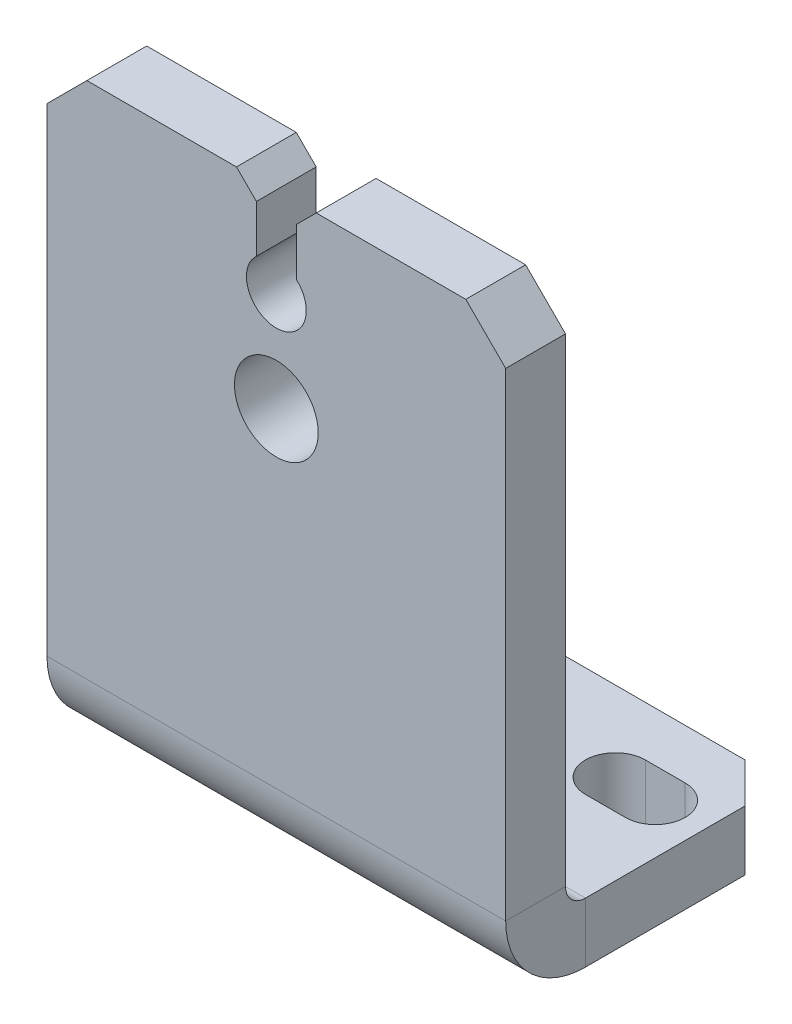
ISO-10303-21;
HEADER;
FILE_DESCRIPTION(('STEP AP214'),'2;1');
FILE_NAME('part.step','',(''),(''),'','','');
FILE_SCHEMA(('AUTOMOTIVE_DESIGN { 1 0 10303 214 1 1 1 1 }'));
ENDSEC;
DATA;
#1=APPLICATION_CONTEXT('core data for automotive mechanical design processes');
#2=APPLICATION_PROTOCOL_DEFINITION('international standard','automotive_design',2000,#1);
#3=PRODUCT_CONTEXT('',#1,'mechanical');
#4=PRODUCT('Part','Part','',(#3));
#5=PRODUCT_RELATED_PRODUCT_CATEGORY('part','',(#4));
#6=PRODUCT_DEFINITION_FORMATION('','',#4);
#7=PRODUCT_DEFINITION_CONTEXT('part definition',#1,'design');
#8=PRODUCT_DEFINITION('design','',#6,#7);
#9=PRODUCT_DEFINITION_SHAPE('','',#8);
#10=(LENGTH_UNIT() NAMED_UNIT(*) SI_UNIT(.MILLI.,.METRE.));
#11=(NAMED_UNIT(*) PLANE_ANGLE_UNIT() SI_UNIT($,.RADIAN.));
#12=(NAMED_UNIT(*) SI_UNIT($,.STERADIAN.) SOLID_ANGLE_UNIT());
#13=UNCERTAINTY_MEASURE_WITH_UNIT(LENGTH_MEASURE(1.E-05),#10,'distance_accuracy_value','');
#14=(GEOMETRIC_REPRESENTATION_CONTEXT(3) GLOBAL_UNCERTAINTY_ASSIGNED_CONTEXT((#13)) GLOBAL_UNIT_ASSIGNED_CONTEXT((#10,
#11,#12)) REPRESENTATION_CONTEXT('',''));
#15=CARTESIAN_POINT('',(0.,0.,0.));
#16=DIRECTION('',(0.,0.,1.));
#17=DIRECTION('',(1.,0.,0.));
#18=AXIS2_PLACEMENT_3D('',#15,#16,#17);
#19=CARTESIAN_POINT('',(-11.5,30.,-3.));
#20=DIRECTION('',(0.,1.,0.));
#21=DIRECTION('',(-1.,0.,0.));
#22=AXIS2_PLACEMENT_3D('',#19,#20,#21);
#23=PLANE('',#22);
#24=DIRECTION('',(-1.,0.,0.));
#25=VECTOR('',#24,1.);
#26=CARTESIAN_POINT('',(-11.5,30.,-3.));
#27=LINE('',#26,#25);
#28=CARTESIAN_POINT('',(9.5,30.,-3.));
#29=VERTEX_POINT('',#28);
#30=CARTESIAN_POINT('',(2.,30.,-3.));
#31=VERTEX_POINT('',#30);
#32=EDGE_CURVE('E302',#29,#31,#27,.T.);
#33=ORIENTED_EDGE('',*,*,#32,.T.);
#34=DIRECTION('',(0.,0.,1.));
#35=VECTOR('',#34,1.);
#36=CARTESIAN_POINT('',(2.,30.,0.));
#37=LINE('',#36,#35);
#38=CARTESIAN_POINT('',(2.,30.,0.));
#39=VERTEX_POINT('',#38);
#40=EDGE_CURVE('E25',#31,#39,#37,.T.);
#41=ORIENTED_EDGE('',*,*,#40,.T.);
#42=DIRECTION('',(-1.,0.,0.));
#43=VECTOR('',#42,1.);
#44=CARTESIAN_POINT('',(-11.5,30.,0.));
#45=LINE('',#44,#43);
#46=CARTESIAN_POINT('',(9.5,30.,0.));
#47=VERTEX_POINT('',#46);
#48=EDGE_CURVE('E298',#47,#39,#45,.T.);
#49=ORIENTED_EDGE('',*,*,#48,.F.);
#50=DIRECTION('',(0.,0.,-1.));
#51=VECTOR('',#50,1.);
#52=CARTESIAN_POINT('',(9.5,30.,-3.));
#53=LINE('',#52,#51);
#54=EDGE_CURVE('E330',#47,#29,#53,.T.);
#55=ORIENTED_EDGE('',*,*,#54,.T.);
#56=EDGE_LOOP('',(#33,#41,#49,#55));
#57=FACE_BOUND('',#56,.T.);
#58=ADVANCED_FACE('F17',(#57),#23,.T.);
#59=CARTESIAN_POINT('',(-11.5,30.,-3.));
#60=DIRECTION('',(-1.,0.,0.));
#61=DIRECTION('',(0.,-1.,0.));
#62=AXIS2_PLACEMENT_3D('',#59,#60,#61);
#63=PLANE('',#62);
#64=DIRECTION('',(0.,-1.,0.));
#65=VECTOR('',#64,1.);
#66=CARTESIAN_POINT('',(-11.5,30.,0.));
#67=LINE('',#66,#65);
#68=CARTESIAN_POINT('',(-11.5,28.,0.));
#69=VERTEX_POINT('',#68);
#70=CARTESIAN_POINT('',(-11.5,4.,0.));
#71=VERTEX_POINT('',#70);
#72=EDGE_CURVE('E292',#69,#71,#67,.T.);
#73=ORIENTED_EDGE('',*,*,#72,.F.);
#74=DIRECTION('',(0.,0.,-1.));
#75=VECTOR('',#74,1.);
#76=CARTESIAN_POINT('',(-11.5,28.,-3.));
#77=LINE('',#76,#75);
#78=CARTESIAN_POINT('',(-11.5,28.,-3.));
#79=VERTEX_POINT('',#78);
#80=EDGE_CURVE('E320',#69,#79,#77,.T.);
#81=ORIENTED_EDGE('',*,*,#80,.T.);
#82=DIRECTION('',(0.,-1.,0.));
#83=VECTOR('',#82,1.);
#84=CARTESIAN_POINT('',(-11.5,30.,-3.));
#85=LINE('',#84,#83);
#86=CARTESIAN_POINT('',(-11.5,4.,-3.));
#87=VERTEX_POINT('',#86);
#88=EDGE_CURVE('E295',#79,#87,#85,.T.);
#89=ORIENTED_EDGE('',*,*,#88,.T.);
#90=DIRECTION('',(0.,0.,1.));
#91=VECTOR('',#90,1.);
#92=CARTESIAN_POINT('',(-11.5,4.,-3.));
#93=LINE('',#92,#91);
#94=EDGE_CURVE('E279',#87,#71,#93,.T.);
#95=ORIENTED_EDGE('',*,*,#94,.T.);
#96=EDGE_LOOP('',(#73,#81,#89,#95));
#97=FACE_BOUND('',#96,.T.);
#98=ADVANCED_FACE('F436',(#97),#63,.T.);
#99=CARTESIAN_POINT('',(-11.5,0.,-3.));
#100=DIRECTION('',(0.,0.,1.));
#101=DIRECTION('',(1.,0.,0.));
#102=AXIS2_PLACEMENT_3D('',#99,#100,#101);
#103=PLANE('',#102);
#104=CARTESIAN_POINT('',(0.,20.5,-3.));
#105=DIRECTION('',(0.,0.,1.));
#106=DIRECTION('',(1.,0.,0.));
#107=AXIS2_PLACEMENT_3D('',#104,#105,#106);
#108=CIRCLE('',#107,2.1);
#109=CARTESIAN_POINT('',(2.1,20.5,-3.));
#110=VERTEX_POINT('',#109);
#111=EDGE_CURVE('E241',#110,#110,#108,.F.);
#112=ORIENTED_EDGE('',*,*,#111,.F.);
#113=EDGE_LOOP('',(#112));
#114=FACE_BOUND('',#113,.T.);
#115=CARTESIAN_POINT('',(-2.,30.,-3.));
#116=VERTEX_POINT('',#115);
#117=CARTESIAN_POINT('',(-9.5,30.,-3.));
#118=VERTEX_POINT('',#117);
#119=EDGE_CURVE('E301',#116,#118,#27,.T.);
#120=ORIENTED_EDGE('',*,*,#119,.F.);
#121=DIRECTION('',(0.707106781186549,-0.707106781186546,0.));
#122=VECTOR('',#121,1.);
#123=CARTESIAN_POINT('',(-1.,29.,-3.));
#124=LINE('',#123,#122);
#125=CARTESIAN_POINT('',(-1.,29.,-3.));
#126=VERTEX_POINT('',#125);
#127=EDGE_CURVE('E360',#116,#126,#124,.T.);
#128=ORIENTED_EDGE('',*,*,#127,.T.);
#129=DIRECTION('',(0.,1.,0.));
#130=VECTOR('',#129,1.);
#131=CARTESIAN_POINT('',(-1.,30.,-3.));
#132=LINE('',#131,#130);
#133=CARTESIAN_POINT('',(-1.,26.6180339887499,-3.));
#134=VERTEX_POINT('',#133);
#135=EDGE_CURVE('E233',#134,#126,#132,.T.);
#136=ORIENTED_EDGE('',*,*,#135,.F.);
#137=CARTESIAN_POINT('',(0.,25.5,-3.));
#138=DIRECTION('',(0.,0.,1.));
#139=DIRECTION('',(1.,0.,0.));
#140=AXIS2_PLACEMENT_3D('',#137,#138,#139);
#141=CIRCLE('',#140,1.5);
#142=CARTESIAN_POINT('',(1.,26.6180339887499,-3.));
#143=VERTEX_POINT('',#142);
#144=EDGE_CURVE('E218',#143,#134,#141,.F.);
#145=ORIENTED_EDGE('',*,*,#144,.F.);
#146=DIRECTION('',(0.,-1.,0.));
#147=VECTOR('',#146,1.);
#148=CARTESIAN_POINT('',(1.,26.6180339887499,-3.));
#149=LINE('',#148,#147);
#150=CARTESIAN_POINT('',(1.,29.,-3.));
#151=VERTEX_POINT('',#150);
#152=EDGE_CURVE('E221',#151,#143,#149,.T.);
#153=ORIENTED_EDGE('',*,*,#152,.F.);
#154=DIRECTION('',(0.707106781186546,0.707106781186549,0.));
#155=VECTOR('',#154,1.);
#156=CARTESIAN_POINT('',(2.,30.,-3.));
#157=LINE('',#156,#155);
#158=EDGE_CURVE('E32',#151,#31,#157,.T.);
#159=ORIENTED_EDGE('',*,*,#158,.T.);
#160=ORIENTED_EDGE('',*,*,#32,.F.);
#161=DIRECTION('',(-0.707106781186548,0.707106781186547,0.));
#162=VECTOR('',#161,1.);
#163=CARTESIAN_POINT('',(11.5,28.,-3.));
#164=LINE('',#163,#162);
#165=CARTESIAN_POINT('',(11.5,28.,-3.));
#166=VERTEX_POINT('',#165);
#167=EDGE_CURVE('E322',#29,#166,#164,.F.);
#168=ORIENTED_EDGE('',*,*,#167,.T.);
#169=DIRECTION('',(0.,1.,0.));
#170=VECTOR('',#169,1.);
#171=CARTESIAN_POINT('',(11.5,30.,-3.));
#172=LINE('',#171,#170);
#173=CARTESIAN_POINT('',(11.5,4.,-3.));
#174=VERTEX_POINT('',#173);
#175=EDGE_CURVE('E297',#174,#166,#172,.T.);
#176=ORIENTED_EDGE('',*,*,#175,.F.);
#177=DIRECTION('',(-1.,0.,0.));
#178=VECTOR('',#177,1.);
#179=CARTESIAN_POINT('',(-11.5,4.,-3.));
#180=LINE('',#179,#178);
#181=EDGE_CURVE('E285',#87,#174,#180,.F.);
#182=ORIENTED_EDGE('',*,*,#181,.F.);
#183=ORIENTED_EDGE('',*,*,#88,.F.);
#184=DIRECTION('',(-0.707106781186547,-0.707106781186548,0.));
#185=VECTOR('',#184,1.);
#186=CARTESIAN_POINT('',(-9.5,30.,-3.));
#187=LINE('',#186,#185);
#188=EDGE_CURVE('E324',#79,#118,#187,.F.);
#189=ORIENTED_EDGE('',*,*,#188,.T.);
#190=EDGE_LOOP('',(#120,#128,#136,#145,#153,#159,#160,#168,#176,#182,#183,#189));
#191=FACE_BOUND('',#190,.T.);
#192=ADVANCED_FACE('F383',(#114,#191),#103,.F.);
#193=CARTESIAN_POINT('',(-11.5,0.,0.));
#194=DIRECTION('',(0.,0.,1.));
#195=DIRECTION('',(1.,0.,0.));
#196=AXIS2_PLACEMENT_3D('',#193,#194,#195);
#197=PLANE('',#196);
#198=DIRECTION('',(0.,-1.,0.));
#199=VECTOR('',#198,1.);
#200=CARTESIAN_POINT('',(-1.,30.,0.));
#201=LINE('',#200,#199);
#202=CARTESIAN_POINT('',(-1.,29.,0.));
#203=VERTEX_POINT('',#202);
#204=CARTESIAN_POINT('',(-1.,26.6180339887499,0.));
#205=VERTEX_POINT('',#204);
#206=EDGE_CURVE('E223',#203,#205,#201,.T.);
#207=ORIENTED_EDGE('',*,*,#206,.F.);
#208=DIRECTION('',(-0.707106781186549,0.707106781186546,0.));
#209=VECTOR('',#208,1.);
#210=CARTESIAN_POINT('',(8.25,19.75,0.));
#211=LINE('',#210,#209);
#212=CARTESIAN_POINT('',(-2.,30.,0.));
#213=VERTEX_POINT('',#212);
#214=EDGE_CURVE('E355',#203,#213,#211,.T.);
#215=ORIENTED_EDGE('',*,*,#214,.T.);
#216=CARTESIAN_POINT('',(-9.5,30.,0.));
#217=VERTEX_POINT('',#216);
#218=EDGE_CURVE('E309',#213,#217,#45,.T.);
#219=ORIENTED_EDGE('',*,*,#218,.T.);
#220=DIRECTION('',(0.707106781186547,0.707106781186548,0.));
#221=VECTOR('',#220,1.);
#222=CARTESIAN_POINT('',(-25.5,14.,0.));
#223=LINE('',#222,#221);
#224=EDGE_CURVE('E318',#217,#69,#223,.F.);
#225=ORIENTED_EDGE('',*,*,#224,.T.);
#226=ORIENTED_EDGE('',*,*,#72,.T.);
#227=DIRECTION('',(-1.,0.,0.));
#228=VECTOR('',#227,1.);
#229=CARTESIAN_POINT('',(-11.5,4.,0.));
#230=LINE('',#229,#228);
#231=CARTESIAN_POINT('',(11.5,4.,0.));
#232=VERTEX_POINT('',#231);
#233=EDGE_CURVE('E272',#71,#232,#230,.F.);
#234=ORIENTED_EDGE('',*,*,#233,.T.);
#235=DIRECTION('',(0.,1.,0.));
#236=VECTOR('',#235,1.);
#237=CARTESIAN_POINT('',(11.5,30.,0.));
#238=LINE('',#237,#236);
#239=CARTESIAN_POINT('',(11.5,28.,0.));
#240=VERTEX_POINT('',#239);
#241=EDGE_CURVE('E306',#232,#240,#238,.T.);
#242=ORIENTED_EDGE('',*,*,#241,.T.);
#243=DIRECTION('',(0.707106781186548,-0.707106781186547,0.));
#244=VECTOR('',#243,1.);
#245=CARTESIAN_POINT('',(14.,25.5,0.));
#246=LINE('',#245,#244);
#247=EDGE_CURVE('E316',#240,#47,#246,.F.);
#248=ORIENTED_EDGE('',*,*,#247,.T.);
#249=ORIENTED_EDGE('',*,*,#48,.T.);
#250=DIRECTION('',(-0.707106781186546,-0.707106781186549,0.));
#251=VECTOR('',#250,1.);
#252=CARTESIAN_POINT('',(-19.75,8.25,0.));
#253=LINE('',#252,#251);
#254=CARTESIAN_POINT('',(1.,29.,0.));
#255=VERTEX_POINT('',#254);
#256=EDGE_CURVE('E353',#39,#255,#253,.T.);
#257=ORIENTED_EDGE('',*,*,#256,.T.);
#258=DIRECTION('',(0.,1.,0.));
#259=VECTOR('',#258,1.);
#260=CARTESIAN_POINT('',(1.,26.6180339887499,0.));
#261=LINE('',#260,#259);
#262=CARTESIAN_POINT('',(1.,26.6180339887499,0.));
#263=VERTEX_POINT('',#262);
#264=EDGE_CURVE('E228',#263,#255,#261,.T.);
#265=ORIENTED_EDGE('',*,*,#264,.F.);
#266=CARTESIAN_POINT('',(0.,25.5,0.));
#267=DIRECTION('',(0.,0.,1.));
#268=DIRECTION('',(1.,0.,0.));
#269=AXIS2_PLACEMENT_3D('',#266,#267,#268);
#270=CIRCLE('',#269,1.5);
#271=EDGE_CURVE('E225',#205,#263,#270,.T.);
#272=ORIENTED_EDGE('',*,*,#271,.F.);
#273=EDGE_LOOP('',(#207,#215,#219,#225,#226,#234,#242,#248,#249,#257,#265,#272));
#274=FACE_BOUND('',#273,.T.);
#275=CARTESIAN_POINT('',(0.,20.5,0.));
#276=DIRECTION('',(0.,0.,1.));
#277=DIRECTION('',(1.,0.,0.));
#278=AXIS2_PLACEMENT_3D('',#275,#276,#277);
#279=CIRCLE('',#278,2.1);
#280=CARTESIAN_POINT('',(2.1,20.5,0.));
#281=VERTEX_POINT('',#280);
#282=EDGE_CURVE('E238',#281,#281,#279,.T.);
#283=ORIENTED_EDGE('',*,*,#282,.F.);
#284=EDGE_LOOP('',(#283));
#285=FACE_BOUND('',#284,.T.);
#286=ADVANCED_FACE('F369',(#274,#285),#197,.T.);
#287=ORIENTED_EDGE('',*,*,#218,.F.);
#288=DIRECTION('',(0.,0.,-1.));
#289=VECTOR('',#288,1.);
#290=CARTESIAN_POINT('',(-2.,30.,-3.));
#291=LINE('',#290,#289);
#292=EDGE_CURVE('E357',#213,#116,#291,.T.);
#293=ORIENTED_EDGE('',*,*,#292,.T.);
#294=ORIENTED_EDGE('',*,*,#119,.T.);
#295=DIRECTION('',(0.,0.,1.));
#296=VECTOR('',#295,1.);
#297=CARTESIAN_POINT('',(-9.5,30.,-3.));
#298=LINE('',#297,#296);
#299=EDGE_CURVE('E304',#118,#217,#298,.T.);
#300=ORIENTED_EDGE('',*,*,#299,.T.);
#301=EDGE_LOOP('',(#287,#293,#294,#300));
#302=FACE_BOUND('',#301,.T.);
#303=ADVANCED_FACE('F438',(#302),#23,.T.);
#304=CARTESIAN_POINT('',(11.5,30.,-3.));
#305=DIRECTION('',(1.,0.,0.));
#306=DIRECTION('',(0.,1.,0.));
#307=AXIS2_PLACEMENT_3D('',#304,#305,#306);
#308=PLANE('',#307);
#309=ORIENTED_EDGE('',*,*,#175,.T.);
#310=DIRECTION('',(0.,0.,1.));
#311=VECTOR('',#310,1.);
#312=CARTESIAN_POINT('',(11.5,28.,-3.));
#313=LINE('',#312,#311);
#314=EDGE_CURVE('E327',#166,#240,#313,.T.);
#315=ORIENTED_EDGE('',*,*,#314,.T.);
#316=ORIENTED_EDGE('',*,*,#241,.F.);
#317=DIRECTION('',(0.,0.,1.));
#318=VECTOR('',#317,1.);
#319=CARTESIAN_POINT('',(11.5,4.,-3.));
#320=LINE('',#319,#318);
#321=EDGE_CURVE('E289',#174,#232,#320,.T.);
#322=ORIENTED_EDGE('',*,*,#321,.F.);
#323=EDGE_LOOP('',(#309,#315,#316,#322));
#324=FACE_BOUND('',#323,.T.);
#325=ADVANCED_FACE('F378',(#324),#308,.T.);
#326=CARTESIAN_POINT('',(11.5,4.,-4.));
#327=DIRECTION('',(1.,0.,0.));
#328=DIRECTION('',(0.,0.,-1.));
#329=AXIS2_PLACEMENT_3D('',#326,#327,#328);
#330=PLANE('',#329);
#331=DIRECTION('',(0.,1.,0.));
#332=VECTOR('',#331,1.);
#333=CARTESIAN_POINT('',(11.5,0.,-4.));
#334=LINE('',#333,#332);
#335=CARTESIAN_POINT('',(11.5,3.,-4.));
#336=VERTEX_POINT('',#335);
#337=CARTESIAN_POINT('',(11.5,0.,-4.));
#338=VERTEX_POINT('',#337);
#339=EDGE_CURVE('E244',#336,#338,#334,.F.);
#340=ORIENTED_EDGE('',*,*,#339,.F.);
#341=CARTESIAN_POINT('',(11.5,4.,-4.));
#342=DIRECTION('',(-1.,0.,0.));
#343=DIRECTION('',(0.,0.,1.));
#344=AXIS2_PLACEMENT_3D('',#341,#342,#343);
#345=CIRCLE('',#344,1.);
#346=EDGE_CURVE('E282',#174,#336,#345,.F.);
#347=ORIENTED_EDGE('',*,*,#346,.F.);
#348=ORIENTED_EDGE('',*,*,#321,.T.);
#349=CARTESIAN_POINT('',(11.5,4.,-4.));
#350=DIRECTION('',(-1.,0.,0.));
#351=DIRECTION('',(0.,0.,1.));
#352=AXIS2_PLACEMENT_3D('',#349,#350,#351);
#353=CIRCLE('',#352,4.);
#354=EDGE_CURVE('E275',#232,#338,#353,.F.);
#355=ORIENTED_EDGE('',*,*,#354,.T.);
#356=EDGE_LOOP('',(#340,#347,#348,#355));
#357=FACE_BOUND('',#356,.T.);
#358=ADVANCED_FACE('F393',(#357),#330,.T.);
#359=CARTESIAN_POINT('',(-11.5,4.,-4.));
#360=DIRECTION('',(1.,0.,0.));
#361=DIRECTION('',(0.,0.,-1.));
#362=AXIS2_PLACEMENT_3D('',#359,#360,#361);
#363=PLANE('',#362);
#364=CARTESIAN_POINT('',(-11.5,4.,-4.));
#365=DIRECTION('',(-1.,0.,0.));
#366=DIRECTION('',(0.,0.,1.));
#367=AXIS2_PLACEMENT_3D('',#364,#365,#366);
#368=CIRCLE('',#367,1.);
#369=CARTESIAN_POINT('',(-11.5,3.,-4.));
#370=VERTEX_POINT('',#369);
#371=EDGE_CURVE('E247',#370,#87,#368,.T.);
#372=ORIENTED_EDGE('',*,*,#371,.F.);
#373=DIRECTION('',(0.,1.,0.));
#374=VECTOR('',#373,1.);
#375=CARTESIAN_POINT('',(-11.5,3.,-4.));
#376=LINE('',#375,#374);
#377=CARTESIAN_POINT('',(-11.5,0.,-4.));
#378=VERTEX_POINT('',#377);
#379=EDGE_CURVE('E265',#370,#378,#376,.F.);
#380=ORIENTED_EDGE('',*,*,#379,.T.);
#381=CARTESIAN_POINT('',(-11.5,4.,-4.));
#382=DIRECTION('',(-1.,0.,0.));
#383=DIRECTION('',(0.,0.,1.));
#384=AXIS2_PLACEMENT_3D('',#381,#382,#383);
#385=CIRCLE('',#384,4.);
#386=EDGE_CURVE('E276',#378,#71,#385,.T.);
#387=ORIENTED_EDGE('',*,*,#386,.T.);
#388=ORIENTED_EDGE('',*,*,#94,.F.);
#389=EDGE_LOOP('',(#372,#380,#387,#388));
#390=FACE_BOUND('',#389,.T.);
#391=ADVANCED_FACE('F405',(#390),#363,.F.);
#392=CARTESIAN_POINT('',(-11.5,4.,-4.));
#393=DIRECTION('',(-1.,0.,0.));
#394=DIRECTION('',(0.,-1.,0.));
#395=AXIS2_PLACEMENT_3D('',#392,#393,#394);
#396=CYLINDRICAL_SURFACE('',#395,4.);
#397=ORIENTED_EDGE('',*,*,#233,.F.);
#398=ORIENTED_EDGE('',*,*,#386,.F.);
#399=DIRECTION('',(-1.,0.,0.));
#400=VECTOR('',#399,1.);
#401=CARTESIAN_POINT('',(11.5,0.,-4.));
#402=LINE('',#401,#400);
#403=EDGE_CURVE('E262',#378,#338,#402,.F.);
#404=ORIENTED_EDGE('',*,*,#403,.T.);
#405=ORIENTED_EDGE('',*,*,#354,.F.);
#406=EDGE_LOOP('',(#397,#398,#404,#405));
#407=FACE_BOUND('',#406,.T.);
#408=ADVANCED_FACE('F651',(#407),#396,.T.);
#409=CARTESIAN_POINT('',(-11.5,4.,-4.));
#410=DIRECTION('',(-1.,0.,0.));
#411=DIRECTION('',(0.,-1.,0.));
#412=AXIS2_PLACEMENT_3D('',#409,#410,#411);
#413=CYLINDRICAL_SURFACE('',#412,1.);
#414=ORIENTED_EDGE('',*,*,#181,.T.);
#415=ORIENTED_EDGE('',*,*,#346,.T.);
#416=DIRECTION('',(-1.,0.,0.));
#417=VECTOR('',#416,1.);
#418=CARTESIAN_POINT('',(11.5,3.,-4.));
#419=LINE('',#418,#417);
#420=EDGE_CURVE('E268',#336,#370,#419,.T.);
#421=ORIENTED_EDGE('',*,*,#420,.T.);
#422=ORIENTED_EDGE('',*,*,#371,.T.);
#423=EDGE_LOOP('',(#414,#415,#421,#422));
#424=FACE_BOUND('',#423,.T.);
#425=ADVANCED_FACE('F388',(#424),#413,.F.);
#426=CARTESIAN_POINT('',(-11.5,0.,-14.));
#427=DIRECTION('',(1.,0.,0.));
#428=DIRECTION('',(0.,1.,0.));
#429=AXIS2_PLACEMENT_3D('',#426,#427,#428);
#430=PLANE('',#429);
#431=DIRECTION('',(0.,0.,1.));
#432=VECTOR('',#431,1.);
#433=CARTESIAN_POINT('',(-11.5,2.99999999999996,-14.));
#434=LINE('',#433,#432);
#435=CARTESIAN_POINT('',(-11.5,3.,-12.));
#436=VERTEX_POINT('',#435);
#437=EDGE_CURVE('E259',#370,#436,#434,.F.);
#438=ORIENTED_EDGE('',*,*,#437,.T.);
#439=DIRECTION('',(0.,-1.,0.));
#440=VECTOR('',#439,1.);
#441=CARTESIAN_POINT('',(-11.5,0.,-12.));
#442=LINE('',#441,#440);
#443=CARTESIAN_POINT('',(-11.5,0.,-12.));
#444=VERTEX_POINT('',#443);
#445=EDGE_CURVE('E341',#436,#444,#442,.T.);
#446=ORIENTED_EDGE('',*,*,#445,.T.);
#447=DIRECTION('',(0.,0.,-1.));
#448=VECTOR('',#447,1.);
#449=CARTESIAN_POINT('',(-11.5,0.,-3.));
#450=LINE('',#449,#448);
#451=EDGE_CURVE('E251',#378,#444,#450,.T.);
#452=ORIENTED_EDGE('',*,*,#451,.F.);
#453=ORIENTED_EDGE('',*,*,#379,.F.);
#454=EDGE_LOOP('',(#438,#446,#452,#453));
#455=FACE_BOUND('',#454,.T.);
#456=ADVANCED_FACE('F409',(#455),#430,.F.);
#457=CARTESIAN_POINT('',(11.5,0.,-3.));
#458=DIRECTION('',(-1.,0.,0.));
#459=DIRECTION('',(0.,-1.,0.));
#460=AXIS2_PLACEMENT_3D('',#457,#458,#459);
#461=PLANE('',#460);
#462=DIRECTION('',(0.,0.,1.));
#463=VECTOR('',#462,1.);
#464=CARTESIAN_POINT('',(11.5,0.,-3.));
#465=LINE('',#464,#463);
#466=CARTESIAN_POINT('',(11.5,0.,-12.));
#467=VERTEX_POINT('',#466);
#468=EDGE_CURVE('E245',#467,#338,#465,.T.);
#469=ORIENTED_EDGE('',*,*,#468,.F.);
#470=DIRECTION('',(0.,1.,0.));
#471=VECTOR('',#470,1.);
#472=CARTESIAN_POINT('',(11.5,0.,-12.));
#473=LINE('',#472,#471);
#474=CARTESIAN_POINT('',(11.5,3.,-12.));
#475=VERTEX_POINT('',#474);
#476=EDGE_CURVE('E347',#467,#475,#473,.T.);
#477=ORIENTED_EDGE('',*,*,#476,.T.);
#478=DIRECTION('',(0.,0.,-1.));
#479=VECTOR('',#478,1.);
#480=CARTESIAN_POINT('',(11.5,3.,-3.));
#481=LINE('',#480,#479);
#482=EDGE_CURVE('E254',#475,#336,#481,.F.);
#483=ORIENTED_EDGE('',*,*,#482,.T.);
#484=ORIENTED_EDGE('',*,*,#339,.T.);
#485=EDGE_LOOP('',(#469,#477,#483,#484));
#486=FACE_BOUND('',#485,.T.);
#487=ADVANCED_FACE('F396',(#486),#461,.F.);
#488=CARTESIAN_POINT('',(-11.5,0.,-3.));
#489=DIRECTION('',(0.,1.,0.));
#490=DIRECTION('',(0.,0.,1.));
#491=AXIS2_PLACEMENT_3D('',#488,#489,#490);
#492=PLANE('',#491);
#493=DIRECTION('',(1.,0.,0.));
#494=VECTOR('',#493,1.);
#495=CARTESIAN_POINT('',(7.,0.,-11.5));
#496=LINE('',#495,#494);
#497=CARTESIAN_POINT('',(7.,0.,-11.5));
#498=VERTEX_POINT('',#497);
#499=CARTESIAN_POINT('',(9.,0.,-11.5));
#500=VERTEX_POINT('',#499);
#501=EDGE_CURVE('E193',#498,#500,#496,.T.);
#502=ORIENTED_EDGE('',*,*,#501,.F.);
#503=CARTESIAN_POINT('',(7.,0.,-10.));
#504=DIRECTION('',(0.,-1.,0.));
#505=DIRECTION('',(0.,0.,-1.));
#506=AXIS2_PLACEMENT_3D('',#503,#504,#505);
#507=CIRCLE('',#506,1.5);
#508=CARTESIAN_POINT('',(7.,0.,-8.5));
#509=VERTEX_POINT('',#508);
#510=EDGE_CURVE('E185',#509,#498,#507,.T.);
#511=ORIENTED_EDGE('',*,*,#510,.F.);
#512=DIRECTION('',(-1.,0.,0.));
#513=VECTOR('',#512,1.);
#514=CARTESIAN_POINT('',(7.,0.,-8.5));
#515=LINE('',#514,#513);
#516=CARTESIAN_POINT('',(9.,0.,-8.5));
#517=VERTEX_POINT('',#516);
#518=EDGE_CURVE('E186',#517,#509,#515,.T.);
#519=ORIENTED_EDGE('',*,*,#518,.F.);
#520=CARTESIAN_POINT('',(9.,0.,-10.));
#521=DIRECTION('',(0.,-1.,0.));
#522=DIRECTION('',(0.,0.,-1.));
#523=AXIS2_PLACEMENT_3D('',#520,#521,#522);
#524=CIRCLE('',#523,1.5);
#525=EDGE_CURVE('E200',#500,#517,#524,.T.);
#526=ORIENTED_EDGE('',*,*,#525,.F.);
#527=EDGE_LOOP('',(#502,#511,#519,#526));
#528=FACE_BOUND('',#527,.T.);
#529=CARTESIAN_POINT('',(-8.,0.,-10.));
#530=DIRECTION('',(0.,-1.,0.));
#531=DIRECTION('',(0.,0.,-1.));
#532=AXIS2_PLACEMENT_3D('',#529,#530,#531);
#533=CIRCLE('',#532,1.5);
#534=CARTESIAN_POINT('',(-8.,0.,-11.5));
#535=VERTEX_POINT('',#534);
#536=EDGE_CURVE('E209',#535,#535,#533,.T.);
#537=ORIENTED_EDGE('',*,*,#536,.F.);
#538=EDGE_LOOP('',(#537));
#539=FACE_BOUND('',#538,.T.);
#540=CARTESIAN_POINT('',(0.,0.,-10.));
#541=DIRECTION('',(0.,-1.,0.));
#542=DIRECTION('',(0.,0.,-1.));
#543=AXIS2_PLACEMENT_3D('',#540,#541,#542);
#544=CIRCLE('',#543,2.25);
#545=CARTESIAN_POINT('',(0.,0.,-12.25));
#546=VERTEX_POINT('',#545);
#547=EDGE_CURVE('E212',#546,#546,#544,.T.);
#548=ORIENTED_EDGE('',*,*,#547,.F.);
#549=EDGE_LOOP('',(#548));
#550=FACE_BOUND('',#549,.T.);
#551=ORIENTED_EDGE('',*,*,#451,.T.);
#552=DIRECTION('',(-0.707106781186546,0.,0.707106781186549));
#553=VECTOR('',#552,1.);
#554=CARTESIAN_POINT('',(-9.5,0.,-14.));
#555=LINE('',#554,#553);
#556=CARTESIAN_POINT('',(-9.5,0.,-14.));
#557=VERTEX_POINT('',#556);
#558=EDGE_CURVE('E345',#444,#557,#555,.F.);
#559=ORIENTED_EDGE('',*,*,#558,.T.);
#560=DIRECTION('',(1.,0.,0.));
#561=VECTOR('',#560,1.);
#562=CARTESIAN_POINT('',(-11.5,0.,-14.));
#563=LINE('',#562,#561);
#564=CARTESIAN_POINT('',(9.5,0.,-14.));
#565=VERTEX_POINT('',#564);
#566=EDGE_CURVE('E248',#557,#565,#563,.T.);
#567=ORIENTED_EDGE('',*,*,#566,.T.);
#568=DIRECTION('',(-0.707106781186549,0.,-0.707106781186546));
#569=VECTOR('',#568,1.);
#570=CARTESIAN_POINT('',(11.5,0.,-12.));
#571=LINE('',#570,#569);
#572=EDGE_CURVE('E343',#565,#467,#571,.F.);
#573=ORIENTED_EDGE('',*,*,#572,.T.);
#574=ORIENTED_EDGE('',*,*,#468,.T.);
#575=ORIENTED_EDGE('',*,*,#403,.F.);
#576=EDGE_LOOP('',(#551,#559,#567,#573,#574,#575));
#577=FACE_BOUND('',#576,.T.);
#578=ADVANCED_FACE('F413',(#528,#539,#550,#577),#492,.F.);
#579=CARTESIAN_POINT('',(-11.5,3.,-3.));
#580=DIRECTION('',(0.,1.,0.));
#581=DIRECTION('',(0.,0.,1.));
#582=AXIS2_PLACEMENT_3D('',#579,#580,#581);
#583=PLANE('',#582);
#584=CARTESIAN_POINT('',(7.,3.,-10.));
#585=DIRECTION('',(0.,1.,0.));
#586=DIRECTION('',(0.,0.,1.));
#587=AXIS2_PLACEMENT_3D('',#584,#585,#586);
#588=CIRCLE('',#587,1.5);
#589=CARTESIAN_POINT('',(7.,3.,-8.5));
#590=VERTEX_POINT('',#589);
#591=CARTESIAN_POINT('',(7.,3.,-11.5));
#592=VERTEX_POINT('',#591);
#593=EDGE_CURVE('E182',#590,#592,#588,.F.);
#594=ORIENTED_EDGE('',*,*,#593,.T.);
#595=DIRECTION('',(1.,0.,0.));
#596=VECTOR('',#595,1.);
#597=CARTESIAN_POINT('',(7.,3.,-11.5));
#598=LINE('',#597,#596);
#599=CARTESIAN_POINT('',(9.,3.,-11.5));
#600=VERTEX_POINT('',#599);
#601=EDGE_CURVE('E166',#592,#600,#598,.T.);
#602=ORIENTED_EDGE('',*,*,#601,.T.);
#603=CARTESIAN_POINT('',(9.,3.,-10.));
#604=DIRECTION('',(0.,1.,0.));
#605=DIRECTION('',(0.,0.,1.));
#606=AXIS2_PLACEMENT_3D('',#603,#604,#605);
#607=CIRCLE('',#606,1.5);
#608=CARTESIAN_POINT('',(9.,3.,-8.5));
#609=VERTEX_POINT('',#608);
#610=EDGE_CURVE('E195',#600,#609,#607,.F.);
#611=ORIENTED_EDGE('',*,*,#610,.T.);
#612=DIRECTION('',(-1.,0.,0.));
#613=VECTOR('',#612,1.);
#614=CARTESIAN_POINT('',(7.,3.,-8.5));
#615=LINE('',#614,#613);
#616=EDGE_CURVE('E191',#609,#590,#615,.T.);
#617=ORIENTED_EDGE('',*,*,#616,.T.);
#618=EDGE_LOOP('',(#594,#602,#611,#617));
#619=FACE_BOUND('',#618,.T.);
#620=CARTESIAN_POINT('',(-8.,3.,-10.));
#621=DIRECTION('',(0.,1.,0.));
#622=DIRECTION('',(0.,0.,1.));
#623=AXIS2_PLACEMENT_3D('',#620,#621,#622);
#624=CIRCLE('',#623,1.5);
#625=CARTESIAN_POINT('',(-8.,3.00000000000001,-8.5));
#626=VERTEX_POINT('',#625);
#627=EDGE_CURVE('E177',#626,#626,#624,.F.);
#628=ORIENTED_EDGE('',*,*,#627,.T.);
#629=EDGE_LOOP('',(#628));
#630=FACE_BOUND('',#629,.T.);
#631=CARTESIAN_POINT('',(0.,3.,-10.));
#632=DIRECTION('',(0.,1.,0.));
#633=DIRECTION('',(0.,0.,1.));
#634=AXIS2_PLACEMENT_3D('',#631,#632,#633);
#635=CIRCLE('',#634,2.25);
#636=CARTESIAN_POINT('',(0.,3.00000000000001,-7.75));
#637=VERTEX_POINT('',#636);
#638=EDGE_CURVE('E217',#637,#637,#635,.T.);
#639=ORIENTED_EDGE('',*,*,#638,.F.);
#640=EDGE_LOOP('',(#639));
#641=FACE_BOUND('',#640,.T.);
#642=DIRECTION('',(-1.,0.,0.));
#643=VECTOR('',#642,1.);
#644=CARTESIAN_POINT('',(11.5,2.99999999999996,-14.));
#645=LINE('',#644,#643);
#646=CARTESIAN_POINT('',(-9.5,2.99999999999996,-14.));
#647=VERTEX_POINT('',#646);
#648=CARTESIAN_POINT('',(9.5,2.99999999999996,-14.));
#649=VERTEX_POINT('',#648);
#650=EDGE_CURVE('E256',#647,#649,#645,.F.);
#651=ORIENTED_EDGE('',*,*,#650,.F.);
#652=DIRECTION('',(0.707106781186546,0.,-0.707106781186549));
#653=VECTOR('',#652,1.);
#654=CARTESIAN_POINT('',(-16.,3.,-7.5));
#655=LINE('',#654,#653);
#656=EDGE_CURVE('E339',#647,#436,#655,.F.);
#657=ORIENTED_EDGE('',*,*,#656,.T.);
#658=ORIENTED_EDGE('',*,*,#437,.F.);
#659=ORIENTED_EDGE('',*,*,#420,.F.);
#660=ORIENTED_EDGE('',*,*,#482,.F.);
#661=DIRECTION('',(0.707106781186549,0.,0.707106781186546));
#662=VECTOR('',#661,1.);
#663=CARTESIAN_POINT('',(4.5,2.99999999999994,-19.));
#664=LINE('',#663,#662);
#665=EDGE_CURVE('E337',#475,#649,#664,.F.);
#666=ORIENTED_EDGE('',*,*,#665,.T.);
#667=EDGE_LOOP('',(#651,#657,#658,#659,#660,#666));
#668=FACE_BOUND('',#667,.T.);
#669=ADVANCED_FACE('F189',(#619,#630,#641,#668),#583,.T.);
#670=CARTESIAN_POINT('',(11.5,0.,-14.));
#671=DIRECTION('',(0.,0.,1.));
#672=DIRECTION('',(0.,-1.,0.));
#673=AXIS2_PLACEMENT_3D('',#670,#671,#672);
#674=PLANE('',#673);
#675=ORIENTED_EDGE('',*,*,#566,.F.);
#676=DIRECTION('',(0.,1.,0.));
#677=VECTOR('',#676,1.);
#678=CARTESIAN_POINT('',(-9.5,0.,-14.));
#679=LINE('',#678,#677);
#680=EDGE_CURVE('E334',#557,#647,#679,.T.);
#681=ORIENTED_EDGE('',*,*,#680,.T.);
#682=ORIENTED_EDGE('',*,*,#650,.T.);
#683=DIRECTION('',(0.,-1.,0.));
#684=VECTOR('',#683,1.);
#685=CARTESIAN_POINT('',(9.5,0.,-14.));
#686=LINE('',#685,#684);
#687=EDGE_CURVE('E332',#649,#565,#686,.T.);
#688=ORIENTED_EDGE('',*,*,#687,.T.);
#689=EDGE_LOOP('',(#675,#681,#682,#688));
#690=FACE_BOUND('',#689,.T.);
#691=ADVANCED_FACE('F419',(#690),#674,.F.);
#692=CARTESIAN_POINT('',(0.,20.5,-14.001));
#693=DIRECTION('',(0.,0.,1.));
#694=DIRECTION('',(1.,0.,0.));
#695=AXIS2_PLACEMENT_3D('',#692,#693,#694);
#696=CYLINDRICAL_SURFACE('',#695,2.1);
#697=ORIENTED_EDGE('',*,*,#282,.T.);
#698=EDGE_LOOP('',(#697));
#699=FACE_BOUND('',#698,.T.);
#700=ORIENTED_EDGE('',*,*,#111,.T.);
#701=EDGE_LOOP('',(#700));
#702=FACE_BOUND('',#701,.T.);
#703=ADVANCED_FACE('F592',(#699,#702),#696,.F.);
#704=CARTESIAN_POINT('',(1.,26.6180339887499,-14.001));
#705=DIRECTION('',(1.,0.,0.));
#706=DIRECTION('',(0.,1.,0.));
#707=AXIS2_PLACEMENT_3D('',#704,#705,#706);
#708=PLANE('',#707);
#709=ORIENTED_EDGE('',*,*,#264,.T.);
#710=DIRECTION('',(0.,0.,-1.));
#711=VECTOR('',#710,1.);
#712=CARTESIAN_POINT('',(1.,29.,-3.));
#713=LINE('',#712,#711);
#714=EDGE_CURVE('E11',#255,#151,#713,.T.);
#715=ORIENTED_EDGE('',*,*,#714,.T.);
#716=ORIENTED_EDGE('',*,*,#152,.T.);
#717=DIRECTION('',(0.,0.,1.));
#718=VECTOR('',#717,1.);
#719=CARTESIAN_POINT('',(1.,26.6180339887499,-14.001));
#720=LINE('',#719,#718);
#721=EDGE_CURVE('E231',#143,#263,#720,.T.);
#722=ORIENTED_EDGE('',*,*,#721,.T.);
#723=EDGE_LOOP('',(#709,#715,#716,#722));
#724=FACE_BOUND('',#723,.T.);
#725=ADVANCED_FACE('F584',(#724),#708,.F.);
#726=CARTESIAN_POINT('',(0.,25.5,-14.001));
#727=DIRECTION('',(0.,0.,1.));
#728=DIRECTION('',(1.,0.,0.));
#729=AXIS2_PLACEMENT_3D('',#726,#727,#728);
#730=CYLINDRICAL_SURFACE('',#729,1.5);
#731=ORIENTED_EDGE('',*,*,#144,.T.);
#732=DIRECTION('',(0.,0.,1.));
#733=VECTOR('',#732,1.);
#734=CARTESIAN_POINT('',(-1.,26.6180339887499,-14.001));
#735=LINE('',#734,#733);
#736=EDGE_CURVE('E230',#134,#205,#735,.T.);
#737=ORIENTED_EDGE('',*,*,#736,.T.);
#738=ORIENTED_EDGE('',*,*,#271,.T.);
#739=ORIENTED_EDGE('',*,*,#721,.F.);
#740=EDGE_LOOP('',(#731,#737,#738,#739));
#741=FACE_BOUND('',#740,.T.);
#742=ADVANCED_FACE('F467',(#741),#730,.F.);
#743=CARTESIAN_POINT('',(-1.,30.,-14.001));
#744=DIRECTION('',(-1.,0.,0.));
#745=DIRECTION('',(0.,-1.,0.));
#746=AXIS2_PLACEMENT_3D('',#743,#744,#745);
#747=PLANE('',#746);
#748=ORIENTED_EDGE('',*,*,#135,.T.);
#749=DIRECTION('',(0.,0.,1.));
#750=VECTOR('',#749,1.);
#751=CARTESIAN_POINT('',(-1.,29.,0.));
#752=LINE('',#751,#750);
#753=EDGE_CURVE('E350',#126,#203,#752,.T.);
#754=ORIENTED_EDGE('',*,*,#753,.T.);
#755=ORIENTED_EDGE('',*,*,#206,.T.);
#756=ORIENTED_EDGE('',*,*,#736,.F.);
#757=EDGE_LOOP('',(#748,#754,#755,#756));
#758=FACE_BOUND('',#757,.T.);
#759=ADVANCED_FACE('F463',(#758),#747,.F.);
#760=CARTESIAN_POINT('',(0.,0.,-10.));
#761=DIRECTION('',(0.,-1.,0.));
#762=DIRECTION('',(0.,0.,-1.));
#763=AXIS2_PLACEMENT_3D('',#760,#761,#762);
#764=CYLINDRICAL_SURFACE('',#763,2.25);
#765=ORIENTED_EDGE('',*,*,#638,.T.);
#766=EDGE_LOOP('',(#765));
#767=FACE_BOUND('',#766,.T.);
#768=ORIENTED_EDGE('',*,*,#547,.T.);
#769=EDGE_LOOP('',(#768));
#770=FACE_BOUND('',#769,.T.);
#771=ADVANCED_FACE('F556',(#767,#770),#764,.F.);
#772=CARTESIAN_POINT('',(-8.,30.001,-10.));
#773=DIRECTION('',(0.,-1.,0.));
#774=DIRECTION('',(0.,0.,-1.));
#775=AXIS2_PLACEMENT_3D('',#772,#773,#774);
#776=CYLINDRICAL_SURFACE('',#775,1.5);
#777=ORIENTED_EDGE('',*,*,#627,.F.);
#778=EDGE_LOOP('',(#777));
#779=FACE_BOUND('',#778,.T.);
#780=ORIENTED_EDGE('',*,*,#536,.T.);
#781=EDGE_LOOP('',(#780));
#782=FACE_BOUND('',#781,.T.);
#783=ADVANCED_FACE('F547',(#779,#782),#776,.F.);
#784=CARTESIAN_POINT('',(7.,30.001,-10.));
#785=DIRECTION('',(0.,-1.,0.));
#786=DIRECTION('',(0.,0.,-1.));
#787=AXIS2_PLACEMENT_3D('',#784,#785,#786);
#788=CYLINDRICAL_SURFACE('',#787,1.5);
#789=DIRECTION('',(0.,-1.,0.));
#790=VECTOR('',#789,1.);
#791=CARTESIAN_POINT('',(7.,30.001,-8.50000000000011));
#792=LINE('',#791,#790);
#793=EDGE_CURVE('E178',#590,#509,#792,.T.);
#794=ORIENTED_EDGE('',*,*,#793,.T.);
#795=ORIENTED_EDGE('',*,*,#510,.T.);
#796=DIRECTION('',(0.,-1.,0.));
#797=VECTOR('',#796,1.);
#798=CARTESIAN_POINT('',(7.,30.001,-11.5));
#799=LINE('',#798,#797);
#800=EDGE_CURVE('E170',#592,#498,#799,.T.);
#801=ORIENTED_EDGE('',*,*,#800,.F.);
#802=ORIENTED_EDGE('',*,*,#593,.F.);
#803=EDGE_LOOP('',(#794,#795,#801,#802));
#804=FACE_BOUND('',#803,.T.);
#805=ADVANCED_FACE('F181',(#804),#788,.F.);
#806=CARTESIAN_POINT('',(7.,30.001,-8.50000000000011));
#807=DIRECTION('',(0.,0.,1.));
#808=DIRECTION('',(0.,-1.,0.));
#809=AXIS2_PLACEMENT_3D('',#806,#807,#808);
#810=PLANE('',#809);
#811=DIRECTION('',(0.,-1.,0.));
#812=VECTOR('',#811,1.);
#813=CARTESIAN_POINT('',(9.,30.001,-8.50000000000011));
#814=LINE('',#813,#812);
#815=EDGE_CURVE('E206',#609,#517,#814,.T.);
#816=ORIENTED_EDGE('',*,*,#815,.T.);
#817=ORIENTED_EDGE('',*,*,#518,.T.);
#818=ORIENTED_EDGE('',*,*,#793,.F.);
#819=ORIENTED_EDGE('',*,*,#616,.F.);
#820=EDGE_LOOP('',(#816,#817,#818,#819));
#821=FACE_BOUND('',#820,.T.);
#822=ADVANCED_FACE('F528',(#821),#810,.F.);
#823=CARTESIAN_POINT('',(9.,30.001,-10.));
#824=DIRECTION('',(0.,-1.,0.));
#825=DIRECTION('',(0.,0.,-1.));
#826=AXIS2_PLACEMENT_3D('',#823,#824,#825);
#827=CYLINDRICAL_SURFACE('',#826,1.5);
#828=DIRECTION('',(0.,-1.,0.));
#829=VECTOR('',#828,1.);
#830=CARTESIAN_POINT('',(9.,30.001,-11.5));
#831=LINE('',#830,#829);
#832=EDGE_CURVE('E172',#600,#500,#831,.T.);
#833=ORIENTED_EDGE('',*,*,#832,.T.);
#834=ORIENTED_EDGE('',*,*,#525,.T.);
#835=ORIENTED_EDGE('',*,*,#815,.F.);
#836=ORIENTED_EDGE('',*,*,#610,.F.);
#837=EDGE_LOOP('',(#833,#834,#835,#836));
#838=FACE_BOUND('',#837,.T.);
#839=ADVANCED_FACE('F519',(#838),#827,.F.);
#840=CARTESIAN_POINT('',(7.,30.001,-11.5));
#841=DIRECTION('',(0.,0.,-1.));
#842=DIRECTION('',(0.,1.,0.));
#843=AXIS2_PLACEMENT_3D('',#840,#841,#842);
#844=PLANE('',#843);
#845=ORIENTED_EDGE('',*,*,#800,.T.);
#846=ORIENTED_EDGE('',*,*,#501,.T.);
#847=ORIENTED_EDGE('',*,*,#832,.F.);
#848=ORIENTED_EDGE('',*,*,#601,.F.);
#849=EDGE_LOOP('',(#845,#846,#847,#848));
#850=FACE_BOUND('',#849,.T.);
#851=ADVANCED_FACE('F168',(#850),#844,.F.);
#852=CARTESIAN_POINT('',(-9.5,30.,-3.));
#853=DIRECTION('',(0.707106781186548,-0.707106781186547,0.));
#854=DIRECTION('',(0.707106781186547,0.707106781186548,0.));
#855=AXIS2_PLACEMENT_3D('',#852,#853,#854);
#856=PLANE('',#855);
#857=ORIENTED_EDGE('',*,*,#188,.F.);
#858=ORIENTED_EDGE('',*,*,#80,.F.);
#859=ORIENTED_EDGE('',*,*,#224,.F.);
#860=ORIENTED_EDGE('',*,*,#299,.F.);
#861=EDGE_LOOP('',(#857,#858,#859,#860));
#862=FACE_BOUND('',#861,.T.);
#863=ADVANCED_FACE('F500',(#862),#856,.F.);
#864=CARTESIAN_POINT('',(11.5,28.,-3.));
#865=DIRECTION('',(-0.707106781186547,-0.707106781186548,0.));
#866=DIRECTION('',(0.707106781186548,-0.707106781186547,0.));
#867=AXIS2_PLACEMENT_3D('',#864,#865,#866);
#868=PLANE('',#867);
#869=ORIENTED_EDGE('',*,*,#167,.F.);
#870=ORIENTED_EDGE('',*,*,#54,.F.);
#871=ORIENTED_EDGE('',*,*,#247,.F.);
#872=ORIENTED_EDGE('',*,*,#314,.F.);
#873=EDGE_LOOP('',(#869,#870,#871,#872));
#874=FACE_BOUND('',#873,.T.);
#875=ADVANCED_FACE('F376',(#874),#868,.F.);
#876=CARTESIAN_POINT('',(-9.5,0.,-14.));
#877=DIRECTION('',(0.707106781186549,0.,0.707106781186546));
#878=DIRECTION('',(0.707106781186546,0.,-0.707106781186549));
#879=AXIS2_PLACEMENT_3D('',#876,#877,#878);
#880=PLANE('',#879);
#881=ORIENTED_EDGE('',*,*,#558,.F.);
#882=ORIENTED_EDGE('',*,*,#445,.F.);
#883=ORIENTED_EDGE('',*,*,#656,.F.);
#884=ORIENTED_EDGE('',*,*,#680,.F.);
#885=EDGE_LOOP('',(#881,#882,#883,#884));
#886=FACE_BOUND('',#885,.T.);
#887=ADVANCED_FACE('F417',(#886),#880,.F.);
#888=CARTESIAN_POINT('',(11.5,0.,-12.));
#889=DIRECTION('',(-0.707106781186546,0.,0.707106781186549));
#890=DIRECTION('',(0.707106781186549,0.,0.707106781186546));
#891=AXIS2_PLACEMENT_3D('',#888,#889,#890);
#892=PLANE('',#891);
#893=ORIENTED_EDGE('',*,*,#572,.F.);
#894=ORIENTED_EDGE('',*,*,#687,.F.);
#895=ORIENTED_EDGE('',*,*,#665,.F.);
#896=ORIENTED_EDGE('',*,*,#476,.F.);
#897=EDGE_LOOP('',(#893,#894,#895,#896));
#898=FACE_BOUND('',#897,.T.);
#899=ADVANCED_FACE('F423',(#898),#892,.F.);
#900=CARTESIAN_POINT('',(-1.,29.,-14.001));
#901=DIRECTION('',(0.707106781186546,0.707106781186549,0.));
#902=DIRECTION('',(-0.707106781186549,0.707106781186546,0.));
#903=AXIS2_PLACEMENT_3D('',#900,#901,#902);
#904=PLANE('',#903);
#905=ORIENTED_EDGE('',*,*,#127,.F.);
#906=ORIENTED_EDGE('',*,*,#292,.F.);
#907=ORIENTED_EDGE('',*,*,#214,.F.);
#908=ORIENTED_EDGE('',*,*,#753,.F.);
#909=EDGE_LOOP('',(#905,#906,#907,#908));
#910=FACE_BOUND('',#909,.T.);
#911=ADVANCED_FACE('F425',(#910),#904,.T.);
#912=CARTESIAN_POINT('',(2.,30.,-3.));
#913=DIRECTION('',(-0.707106781186549,0.707106781186546,0.));
#914=DIRECTION('',(-0.707106781186546,-0.707106781186549,0.));
#915=AXIS2_PLACEMENT_3D('',#912,#913,#914);
#916=PLANE('',#915);
#917=ORIENTED_EDGE('',*,*,#158,.F.);
#918=ORIENTED_EDGE('',*,*,#714,.F.);
#919=ORIENTED_EDGE('',*,*,#256,.F.);
#920=ORIENTED_EDGE('',*,*,#40,.F.);
#921=EDGE_LOOP('',(#917,#918,#919,#920));
#922=FACE_BOUND('',#921,.T.);
#923=ADVANCED_FACE('F19',(#922),#916,.T.);
#924=CLOSED_SHELL('',(#58,#98,#192,#286,#303,#325,#358,#391,#408,#425,#456,#487,#578,#669,#691,
#703,#725,#742,#759,#771,#783,#805,#822,#839,#851,#863,#875,#887,#899,#911,#923));
#925=MANIFOLD_SOLID_BREP('B1',#924);
#926=ADVANCED_BREP_SHAPE_REPRESENTATION('',(#18,#925),#14);
#927=SHAPE_DEFINITION_REPRESENTATION(#9,#926);
ENDSEC;
END-ISO-10303-21;
